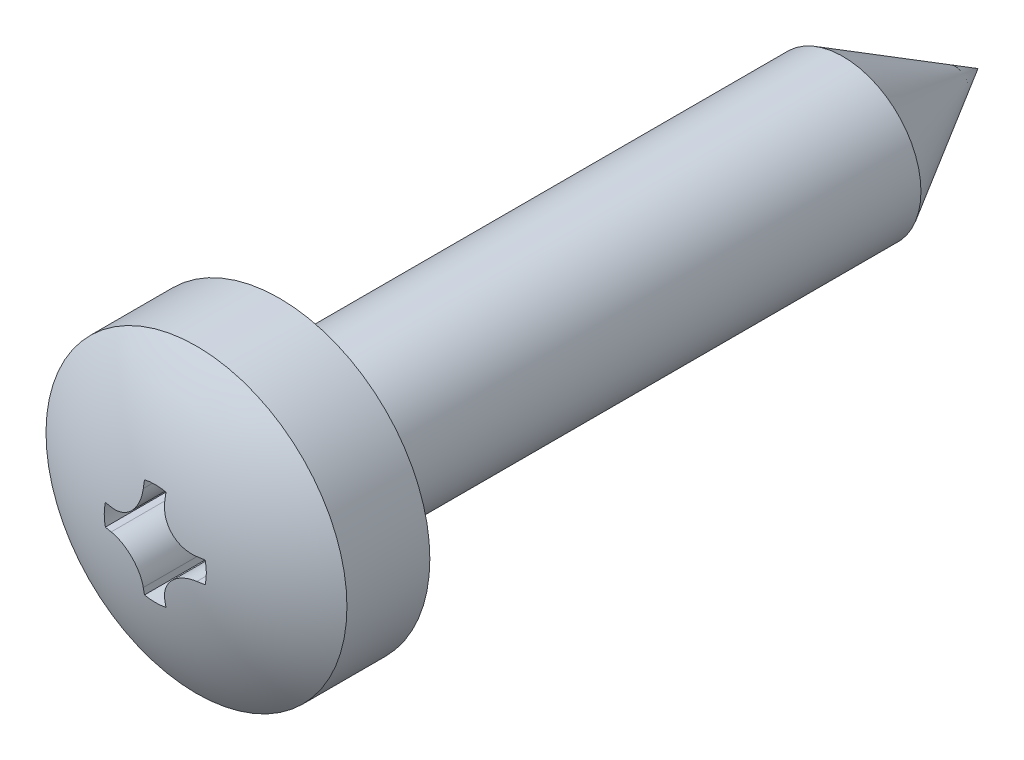
ISO-10303-21;
HEADER;
FILE_DESCRIPTION(('STEP AP214'),'2;1');
FILE_NAME('part.step','',(''),(''),'','','');
FILE_SCHEMA(('AUTOMOTIVE_DESIGN { 1 0 10303 214 1 1 1 1 }'));
ENDSEC;
DATA;
#1=APPLICATION_CONTEXT('core data for automotive mechanical design processes');
#2=APPLICATION_PROTOCOL_DEFINITION('international standard','automotive_design',2000,#1);
#3=PRODUCT_CONTEXT('',#1,'mechanical');
#4=PRODUCT('Part','Part','',(#3));
#5=PRODUCT_RELATED_PRODUCT_CATEGORY('part','',(#4));
#6=PRODUCT_DEFINITION_FORMATION('','',#4);
#7=PRODUCT_DEFINITION_CONTEXT('part definition',#1,'design');
#8=PRODUCT_DEFINITION('design','',#6,#7);
#9=PRODUCT_DEFINITION_SHAPE('','',#8);
#10=(LENGTH_UNIT() NAMED_UNIT(*) SI_UNIT(.MILLI.,.METRE.));
#11=(NAMED_UNIT(*) PLANE_ANGLE_UNIT() SI_UNIT($,.RADIAN.));
#12=(NAMED_UNIT(*) SI_UNIT($,.STERADIAN.) SOLID_ANGLE_UNIT());
#13=UNCERTAINTY_MEASURE_WITH_UNIT(LENGTH_MEASURE(1.E-05),#10,'distance_accuracy_value','');
#14=(GEOMETRIC_REPRESENTATION_CONTEXT(3) GLOBAL_UNCERTAINTY_ASSIGNED_CONTEXT((#13)) GLOBAL_UNIT_ASSIGNED_CONTEXT((#10,
#11,#12)) REPRESENTATION_CONTEXT('',''));
#15=CARTESIAN_POINT('',(0.,0.,0.));
#16=DIRECTION('',(0.,0.,1.));
#17=DIRECTION('',(1.,0.,0.));
#18=AXIS2_PLACEMENT_3D('',#15,#16,#17);
#19=CARTESIAN_POINT('',(0.,0.,10.4));
#20=DIRECTION('',(0.,0.,1.));
#21=DIRECTION('',(0.,1.,0.));
#22=AXIS2_PLACEMENT_3D('',#19,#20,#21);
#23=SPHERICAL_SURFACE('',#22,5.);
#24=CARTESIAN_POINT('',(0.,0.,14.5424630354416));
#25=DIRECTION('',(0.,0.,1.));
#26=DIRECTION('',(1.,0.,0.));
#27=AXIS2_PLACEMENT_3D('',#24,#25,#26);
#28=CIRCLE('',#27,2.8);
#29=CARTESIAN_POINT('',(2.8,0.,14.5424630354416));
#30=VERTEX_POINT('',#29);
#31=EDGE_CURVE('E187',#30,#30,#28,.T.);
#32=ORIENTED_EDGE('',*,*,#31,.T.);
#33=EDGE_LOOP('',(#32));
#34=FACE_BOUND('',#33,.T.);
#35=CARTESIAN_POINT('',(0.,0.,15.3089204515861));
#36=DIRECTION('',(0.,0.,-1.));
#37=DIRECTION('',(-1.,0.,0.));
#38=AXIS2_PLACEMENT_3D('',#35,#36,#37);
#39=CIRCLE('',#38,0.95);
#40=CARTESIAN_POINT('',(0.199999999999999,0.928708781050336,15.3089204515861));
#41=VERTEX_POINT('',#40);
#42=CARTESIAN_POINT('',(-0.199999999999997,0.928708781050336,15.3089204515861));
#43=VERTEX_POINT('',#42);
#44=EDGE_CURVE('E291',#41,#43,#39,.F.);
#45=ORIENTED_EDGE('',*,*,#44,.F.);
#46=CARTESIAN_POINT('',(0.200000000000013,0.,10.4));
#47=DIRECTION('',(-1.,0.,0.));
#48=DIRECTION('',(0.,-1.,0.));
#49=AXIS2_PLACEMENT_3D('',#46,#47,#48);
#50=CIRCLE('',#49,4.99599839871872);
#51=CARTESIAN_POINT('',(0.200000000000001,0.797500009462237,15.3319361040982));
#52=VERTEX_POINT('',#51);
#53=EDGE_CURVE('E173',#52,#41,#50,.T.);
#54=ORIENTED_EDGE('',*,*,#53,.F.);
#55=CARTESIAN_POINT('',(0.200000033472805,0.797700009462236,15.3319037583386));
#56=CARTESIAN_POINT('',(0.199959253117828,0.764708817685606,15.3372450026347));
#57=CARTESIAN_POINT('',(0.202709128813232,0.731640466129004,15.3421389681577));
#58=CARTESIAN_POINT('',(0.213653637195818,0.666282732986849,15.3509117634436));
#59=CARTESIAN_POINT('',(0.221847801353419,0.633993284617508,15.3547906805205));
#60=CARTESIAN_POINT('',(0.243555568778322,0.571088201610532,15.3614171793675));
#61=CARTESIAN_POINT('',(0.257074653927373,0.540474329048727,15.364163589265));
#62=CARTESIAN_POINT('',(0.289068737352572,0.481878485435129,15.3684353734394));
#63=CARTESIAN_POINT('',(0.307541534947129,0.453895353117194,15.3699612887238));
#64=CARTESIAN_POINT('',(0.348646595686665,0.401741777280698,15.371733860277));
#65=CARTESIAN_POINT('',(0.371219136327946,0.377524829205055,15.3719975623989));
#66=CARTESIAN_POINT('',(0.42004221247523,0.33315104363588,15.3712838517845));
#67=CARTESIAN_POINT('',(0.446293163672993,0.312994665649831,15.3703062986749));
#68=CARTESIAN_POINT('',(0.501529122246131,0.277422821121843,15.3671501235125));
#69=CARTESIAN_POINT('',(0.530496065410742,0.261978583187333,15.3649790268822));
#70=CARTESIAN_POINT('',(0.590474078177402,0.236061672214504,15.3595049326867));
#71=CARTESIAN_POINT('',(0.621484749229964,0.225588033102557,15.3562021552872));
#72=CARTESIAN_POINT('',(0.676782180778131,0.211811110107704,15.349515949383));
#73=CARTESIAN_POINT('',(0.700820773823944,0.207371844731834,15.3463573247891));
#74=CARTESIAN_POINT('',(0.749150929493059,0.201461310152338,15.3395132745871));
#75=CARTESIAN_POINT('',(0.773442081704409,0.199985810303452,15.3358286079455));
#76=CARTESIAN_POINT('',(0.797700009462238,0.200000033472804,15.3319037583386));
#77=B_SPLINE_CURVE_WITH_KNOTS('',3,(#55,#56,#57,#58,#59,#60,#61,#62,#63,#64,#65,#66,#67,#68,#69,
#70,#71,#72,#73,#74,#75,#76),.UNSPECIFIED.,.F.,.F.,(4,2,2,2,2,2,2,2,2,2,4),(0.,
0.100151318053274,0.200294018308518,0.30054008372607,0.400741688499828,0.499586204595047,
0.598441899985654,0.696681331546744,0.794901661700852,0.868668187611341,0.942329339997771),.UNSPECIFIED.);
#78=CARTESIAN_POINT('',(0.797500009462238,0.2,15.3319361040982));
#79=VERTEX_POINT('',#78);
#80=EDGE_CURVE('E282',#52,#79,#77,.T.);
#81=ORIENTED_EDGE('',*,*,#80,.T.);
#82=CARTESIAN_POINT('',(0.,0.200000000000013,10.4));
#83=DIRECTION('',(0.,1.,0.));
#84=DIRECTION('',(-1.,0.,0.));
#85=AXIS2_PLACEMENT_3D('',#82,#83,#84);
#86=CIRCLE('',#85,4.99599839871872);
#87=CARTESIAN_POINT('',(0.928708781050337,0.199999999999998,15.3089204515861));
#88=VERTEX_POINT('',#87);
#89=EDGE_CURVE('E289',#79,#88,#86,.T.);
#90=ORIENTED_EDGE('',*,*,#89,.T.);
#91=CARTESIAN_POINT('',(0.,0.,15.3089204515861));
#92=DIRECTION('',(0.,0.,-1.));
#93=DIRECTION('',(-1.,0.,0.));
#94=AXIS2_PLACEMENT_3D('',#91,#92,#93);
#95=CIRCLE('',#94,0.950000000000001);
#96=CARTESIAN_POINT('',(0.928708781050337,-0.199999999999996,15.3089204515861));
#97=VERTEX_POINT('',#96);
#98=EDGE_CURVE('E364',#88,#97,#95,.T.);
#99=ORIENTED_EDGE('',*,*,#98,.T.);
#100=CARTESIAN_POINT('',(0.,-0.200000000000022,10.4));
#101=DIRECTION('',(0.,1.,0.));
#102=DIRECTION('',(-1.,0.,0.));
#103=AXIS2_PLACEMENT_3D('',#100,#101,#102);
#104=CIRCLE('',#103,4.99599839871872);
#105=CARTESIAN_POINT('',(0.797500009462238,-0.2,15.3319361040982));
#106=VERTEX_POINT('',#105);
#107=EDGE_CURVE('E254',#106,#97,#104,.T.);
#108=ORIENTED_EDGE('',*,*,#107,.F.);
#109=CARTESIAN_POINT('',(0.200000033472805,-0.797700009462236,15.3319037583386));
#110=CARTESIAN_POINT('',(0.199959253117828,-0.764708817685605,15.3372450026347));
#111=CARTESIAN_POINT('',(0.202709128813232,-0.731640466129003,15.3421389681577));
#112=CARTESIAN_POINT('',(0.213653637195818,-0.666282732986848,15.3509117634436));
#113=CARTESIAN_POINT('',(0.221847801353419,-0.633993284617508,15.3547906805205));
#114=CARTESIAN_POINT('',(0.243555568778322,-0.571088201610531,15.3614171793675));
#115=CARTESIAN_POINT('',(0.257074653927373,-0.540474329048727,15.364163589265));
#116=CARTESIAN_POINT('',(0.289068737352572,-0.481878485435129,15.3684353734394));
#117=CARTESIAN_POINT('',(0.30754153494713,-0.453895353117194,15.3699612887238));
#118=CARTESIAN_POINT('',(0.348646595686666,-0.401741777280697,15.371733860277));
#119=CARTESIAN_POINT('',(0.371219136327946,-0.377524829205055,15.3719975623989));
#120=CARTESIAN_POINT('',(0.42004221247523,-0.33315104363588,15.3712838517845));
#121=CARTESIAN_POINT('',(0.446293163672993,-0.31299466564983,15.370306298675));
#122=CARTESIAN_POINT('',(0.501529122246131,-0.277422821121843,15.3671501235125));
#123=CARTESIAN_POINT('',(0.530496065410743,-0.261978583187333,15.3649790268822));
#124=CARTESIAN_POINT('',(0.590474078177402,-0.236061672214504,15.3595049326867));
#125=CARTESIAN_POINT('',(0.621484749229964,-0.225588033102557,15.3562021552872));
#126=CARTESIAN_POINT('',(0.676782180778131,-0.211811110107704,15.349515949383));
#127=CARTESIAN_POINT('',(0.700820773823944,-0.207371844731834,15.3463573247891));
#128=CARTESIAN_POINT('',(0.749150929493059,-0.201461310152338,15.3395132745871));
#129=CARTESIAN_POINT('',(0.773442081704409,-0.199985810303452,15.3358286079455));
#130=CARTESIAN_POINT('',(0.797700009462237,-0.200000033472804,15.3319037583386));
#131=B_SPLINE_CURVE_WITH_KNOTS('',3,(#109,#110,#111,#112,#113,#114,#115,#116,#117,#118,#119,
#120,#121,#122,#123,#124,#125,#126,#127,#128,#129,#130),.UNSPECIFIED.,.F.,.F.,(4,2,2,2,2,2,2,2,
2,2,4),(0.,0.100151318053274,0.200294018308518,0.300540083726071,0.400741688499828,
0.499586204595048,0.598441899985654,0.696681331546745,0.794901661700852,0.868668187611341,
0.94232933999777),.UNSPECIFIED.);
#132=CARTESIAN_POINT('',(0.200000000000001,-0.797500009462237,15.3319361040982));
#133=VERTEX_POINT('',#132);
#134=EDGE_CURVE('E248',#133,#106,#131,.T.);
#135=ORIENTED_EDGE('',*,*,#134,.F.);
#136=CARTESIAN_POINT('',(0.20000000000001,0.,10.4));
#137=DIRECTION('',(1.,0.,0.));
#138=DIRECTION('',(0.,1.,0.));
#139=AXIS2_PLACEMENT_3D('',#136,#137,#138);
#140=CIRCLE('',#139,4.99599839871872);
#141=CARTESIAN_POINT('',(0.199999999999999,-0.928708781050336,15.3089204515861));
#142=VERTEX_POINT('',#141);
#143=EDGE_CURVE('E245',#133,#142,#140,.T.);
#144=ORIENTED_EDGE('',*,*,#143,.T.);
#145=CARTESIAN_POINT('',(0.,0.,15.3089204515861));
#146=DIRECTION('',(0.,0.,-1.));
#147=DIRECTION('',(-1.,0.,0.));
#148=AXIS2_PLACEMENT_3D('',#145,#146,#147);
#149=CIRCLE('',#148,0.95);
#150=CARTESIAN_POINT('',(-0.199999999999997,-0.928708781050336,15.3089204515861));
#151=VERTEX_POINT('',#150);
#152=EDGE_CURVE('E242',#142,#151,#149,.T.);
#153=ORIENTED_EDGE('',*,*,#152,.T.);
#154=CARTESIAN_POINT('',(-0.200000000000015,0.,10.4));
#155=DIRECTION('',(1.,0.,0.));
#156=DIRECTION('',(0.,1.,0.));
#157=AXIS2_PLACEMENT_3D('',#154,#155,#156);
#158=CIRCLE('',#157,4.99599839871872);
#159=CARTESIAN_POINT('',(-0.2,-0.797500009462236,15.3319361040982));
#160=VERTEX_POINT('',#159);
#161=EDGE_CURVE('E239',#160,#151,#158,.T.);
#162=ORIENTED_EDGE('',*,*,#161,.F.);
#163=CARTESIAN_POINT('',(-0.200000033472803,-0.797700009462235,15.3319037583386));
#164=CARTESIAN_POINT('',(-0.199959253117827,-0.764708817685605,15.3372450026347));
#165=CARTESIAN_POINT('',(-0.202709128813231,-0.731640466129003,15.3421389681577));
#166=CARTESIAN_POINT('',(-0.213653637195817,-0.666282732986847,15.3509117634436));
#167=CARTESIAN_POINT('',(-0.221847801353417,-0.633993284617507,15.3547906805205));
#168=CARTESIAN_POINT('',(-0.243555568778321,-0.57108820161053,15.3614171793675));
#169=CARTESIAN_POINT('',(-0.257074653927372,-0.540474329048725,15.364163589265));
#170=CARTESIAN_POINT('',(-0.289068737352571,-0.481878485435128,15.3684353734394));
#171=CARTESIAN_POINT('',(-0.307541534947129,-0.453895353117193,15.3699612887238));
#172=CARTESIAN_POINT('',(-0.348646595686664,-0.401741777280696,15.371733860277));
#173=CARTESIAN_POINT('',(-0.371219136327945,-0.377524829205054,15.3719975623989));
#174=CARTESIAN_POINT('',(-0.420042212475229,-0.333151043635879,15.3712838517845));
#175=CARTESIAN_POINT('',(-0.446293163672992,-0.312994665649829,15.370306298675));
#176=CARTESIAN_POINT('',(-0.50152912224613,-0.277422821121842,15.3671501235125));
#177=CARTESIAN_POINT('',(-0.530496065410741,-0.261978583187332,15.3649790268822));
#178=CARTESIAN_POINT('',(-0.590474078177401,-0.236061672214503,15.3595049326867));
#179=CARTESIAN_POINT('',(-0.621484749229963,-0.225588033102557,15.3562021552872));
#180=CARTESIAN_POINT('',(-0.676782180778129,-0.211811110107703,15.349515949383));
#181=CARTESIAN_POINT('',(-0.700820773823943,-0.207371844731833,15.3463573247891));
#182=CARTESIAN_POINT('',(-0.749150929493057,-0.201461310152337,15.3395132745871));
#183=CARTESIAN_POINT('',(-0.773442081704407,-0.199985810303451,15.3358286079455));
#184=CARTESIAN_POINT('',(-0.797700009462235,-0.200000033472803,15.3319037583386));
#185=B_SPLINE_CURVE_WITH_KNOTS('',3,(#163,#164,#165,#166,#167,#168,#169,#170,#171,#172,#173,
#174,#175,#176,#177,#178,#179,#180,#181,#182,#183,#184),.UNSPECIFIED.,.F.,.F.,(4,2,2,2,2,2,2,2,
2,2,4),(0.,0.100151318053273,0.200294018308518,0.300540083726071,0.400741688499828,
0.499586204595048,0.598441899985654,0.696681331546744,0.794901661700852,0.868668187611341,
0.942329339997769),.UNSPECIFIED.);
#186=CARTESIAN_POINT('',(-0.797500009462236,-0.199999999999999,15.3319361040982));
#187=VERTEX_POINT('',#186);
#188=EDGE_CURVE('E232',#160,#187,#185,.T.);
#189=ORIENTED_EDGE('',*,*,#188,.T.);
#190=CARTESIAN_POINT('',(0.,-0.200000000000015,10.4));
#191=DIRECTION('',(0.,-1.,0.));
#192=DIRECTION('',(1.,0.,0.));
#193=AXIS2_PLACEMENT_3D('',#190,#191,#192);
#194=CIRCLE('',#193,4.99599839871872);
#195=CARTESIAN_POINT('',(-0.928708781050336,-0.199999999999997,15.3089204515861));
#196=VERTEX_POINT('',#195);
#197=EDGE_CURVE('E240',#187,#196,#194,.T.);
#198=ORIENTED_EDGE('',*,*,#197,.T.);
#199=CARTESIAN_POINT('',(0.,0.,15.3089204515861));
#200=DIRECTION('',(0.,0.,-1.));
#201=DIRECTION('',(-1.,0.,0.));
#202=AXIS2_PLACEMENT_3D('',#199,#200,#201);
#203=CIRCLE('',#202,0.95);
#204=CARTESIAN_POINT('',(-0.928708781050336,0.199999999999997,15.3089204515861));
#205=VERTEX_POINT('',#204);
#206=EDGE_CURVE('E403',#205,#196,#203,.F.);
#207=ORIENTED_EDGE('',*,*,#206,.F.);
#208=CARTESIAN_POINT('',(0.,0.200000000000015,10.4));
#209=DIRECTION('',(0.,-1.,0.));
#210=DIRECTION('',(1.,0.,0.));
#211=AXIS2_PLACEMENT_3D('',#208,#209,#210);
#212=CIRCLE('',#211,4.99599839871872);
#213=CARTESIAN_POINT('',(-0.797500009462236,0.199999999999999,15.3319361040982));
#214=VERTEX_POINT('',#213);
#215=EDGE_CURVE('E200',#214,#205,#212,.T.);
#216=ORIENTED_EDGE('',*,*,#215,.F.);
#217=CARTESIAN_POINT('',(-0.200000033472804,0.797700009462235,15.3319037583386));
#218=CARTESIAN_POINT('',(-0.199959253117827,0.764708817685605,15.3372450026347));
#219=CARTESIAN_POINT('',(-0.202709128813231,0.731640466129002,15.3421389681577));
#220=CARTESIAN_POINT('',(-0.213653637195817,0.666282732986847,15.3509117634436));
#221=CARTESIAN_POINT('',(-0.221847801353417,0.633993284617507,15.3547906805205));
#222=CARTESIAN_POINT('',(-0.24355556877832,0.571088201610531,15.3614171793675));
#223=CARTESIAN_POINT('',(-0.257074653927372,0.540474329048726,15.364163589265));
#224=CARTESIAN_POINT('',(-0.28906873735257,0.481878485435128,15.3684353734394));
#225=CARTESIAN_POINT('',(-0.307541534947128,0.453895353117193,15.3699612887238));
#226=CARTESIAN_POINT('',(-0.348646595686664,0.401741777280697,15.371733860277));
#227=CARTESIAN_POINT('',(-0.371219136327945,0.377524829205054,15.3719975623989));
#228=CARTESIAN_POINT('',(-0.420042212475228,0.333151043635879,15.3712838517845));
#229=CARTESIAN_POINT('',(-0.446293163672991,0.31299466564983,15.370306298675));
#230=CARTESIAN_POINT('',(-0.501529122246129,0.277422821121843,15.3671501235125));
#231=CARTESIAN_POINT('',(-0.53049606541074,0.261978583187332,15.3649790268822));
#232=CARTESIAN_POINT('',(-0.5904740781774,0.236061672214503,15.3595049326867));
#233=CARTESIAN_POINT('',(-0.621484749229962,0.225588033102557,15.3562021552872));
#234=CARTESIAN_POINT('',(-0.676782180778129,0.211811110107703,15.349515949383));
#235=CARTESIAN_POINT('',(-0.700820773823943,0.207371844731833,15.3463573247891));
#236=CARTESIAN_POINT('',(-0.749150929493057,0.201461310152337,15.3395132745871));
#237=CARTESIAN_POINT('',(-0.773442081704407,0.199985810303451,15.3358286079455));
#238=CARTESIAN_POINT('',(-0.797700009462235,0.200000033472803,15.3319037583386));
#239=B_SPLINE_CURVE_WITH_KNOTS('',3,(#217,#218,#219,#220,#221,#222,#223,#224,#225,#226,#227,
#228,#229,#230,#231,#232,#233,#234,#235,#236,#237,#238),.UNSPECIFIED.,.F.,.F.,(4,2,2,2,2,2,2,2,
2,2,4),(0.,0.100151318053274,0.200294018308518,0.30054008372607,0.400741688499828,
0.499586204595047,0.598441899985653,0.696681331546744,0.794901661700851,0.868668187611341,
0.94232933999777),.UNSPECIFIED.);
#240=CARTESIAN_POINT('',(-0.2,0.797500009462236,15.3319361040982));
#241=VERTEX_POINT('',#240);
#242=EDGE_CURVE('E193',#241,#214,#239,.T.);
#243=ORIENTED_EDGE('',*,*,#242,.F.);
#244=CARTESIAN_POINT('',(-0.200000000000015,0.,10.4));
#245=DIRECTION('',(-1.,0.,0.));
#246=DIRECTION('',(0.,-1.,0.));
#247=AXIS2_PLACEMENT_3D('',#244,#245,#246);
#248=CIRCLE('',#247,4.99599839871872);
#249=EDGE_CURVE('E190',#241,#43,#248,.T.);
#250=ORIENTED_EDGE('',*,*,#249,.T.);
#251=EDGE_LOOP('',(#45,#54,#81,#90,#99,#108,#135,#144,#153,#162,#189,#198,#207,#216,#243,#250));
#252=FACE_BOUND('',#251,.T.);
#253=ADVANCED_FACE('F38',(#34,#252),#23,.T.);
#254=CARTESIAN_POINT('',(0.,0.,0.));
#255=DIRECTION('',(0.,0.,1.));
#256=DIRECTION('',(1.,0.,0.));
#257=AXIS2_PLACEMENT_3D('',#254,#255,#256);
#258=CONICAL_SURFACE('',#257,0.,0.523598775598293);
#259=CARTESIAN_POINT('',(0.,0.,2.5114736709749));
#260=DIRECTION('',(0.,0.,1.));
#261=DIRECTION('',(1.,0.,0.));
#262=AXIS2_PLACEMENT_3D('',#259,#260,#261);
#263=CIRCLE('',#262,1.45);
#264=CARTESIAN_POINT('',(1.45,0.,2.5114736709749));
#265=VERTEX_POINT('',#264);
#266=EDGE_CURVE('E174',#265,#265,#263,.T.);
#267=ORIENTED_EDGE('',*,*,#266,.F.);
#268=EDGE_LOOP('',(#267));
#269=FACE_BOUND('',#268,.T.);
#270=CARTESIAN_POINT('',(0.,0.,0.));
#271=VERTEX_POINT('',#270);
#272=VERTEX_LOOP('',#271);
#273=FACE_BOUND('',#272,.T.);
#274=ADVANCED_FACE('F305',(#269,#273),#258,.T.);
#275=CARTESIAN_POINT('',(0.,0.,11.71));
#276=DIRECTION('',(0.,0.,1.));
#277=DIRECTION('',(1.,0.,0.));
#278=AXIS2_PLACEMENT_3D('',#275,#276,#277);
#279=CYLINDRICAL_SURFACE('',#278,2.8);
#280=ORIENTED_EDGE('',*,*,#31,.F.);
#281=EDGE_LOOP('',(#280));
#282=FACE_BOUND('',#281,.T.);
#283=CARTESIAN_POINT('',(0.,0.,13.));
#284=DIRECTION('',(0.,0.,1.));
#285=DIRECTION('',(1.,0.,0.));
#286=AXIS2_PLACEMENT_3D('',#283,#284,#285);
#287=CIRCLE('',#286,2.8);
#288=CARTESIAN_POINT('',(2.8,0.,13.));
#289=VERTEX_POINT('',#288);
#290=EDGE_CURVE('E178',#289,#289,#287,.T.);
#291=ORIENTED_EDGE('',*,*,#290,.T.);
#292=EDGE_LOOP('',(#291));
#293=FACE_BOUND('',#292,.T.);
#294=ADVANCED_FACE('F310',(#282,#293),#279,.T.);
#295=CARTESIAN_POINT('',(0.,2.8,13.));
#296=DIRECTION('',(0.,0.,1.));
#297=DIRECTION('',(1.,0.,0.));
#298=AXIS2_PLACEMENT_3D('',#295,#296,#297);
#299=PLANE('',#298);
#300=CARTESIAN_POINT('',(0.,0.,13.));
#301=DIRECTION('',(0.,0.,1.));
#302=DIRECTION('',(1.,0.,0.));
#303=AXIS2_PLACEMENT_3D('',#300,#301,#302);
#304=CIRCLE('',#303,1.55);
#305=CARTESIAN_POINT('',(1.55,0.,13.));
#306=VERTEX_POINT('',#305);
#307=EDGE_CURVE('E47',#306,#306,#304,.T.);
#308=ORIENTED_EDGE('',*,*,#307,.T.);
#309=EDGE_LOOP('',(#308));
#310=FACE_BOUND('',#309,.T.);
#311=ORIENTED_EDGE('',*,*,#290,.F.);
#312=EDGE_LOOP('',(#311));
#313=FACE_BOUND('',#312,.T.);
#314=ADVANCED_FACE('F295',(#310,#313),#299,.F.);
#315=CARTESIAN_POINT('',(0.,0.,11.71));
#316=DIRECTION('',(0.,0.,1.));
#317=DIRECTION('',(1.,0.,0.));
#318=AXIS2_PLACEMENT_3D('',#315,#316,#317);
#319=CYLINDRICAL_SURFACE('',#318,1.45);
#320=CARTESIAN_POINT('',(0.,0.,12.9));
#321=DIRECTION('',(0.,0.,1.));
#322=DIRECTION('',(1.,0.,0.));
#323=AXIS2_PLACEMENT_3D('',#320,#321,#322);
#324=CIRCLE('',#323,1.45);
#325=CARTESIAN_POINT('',(1.45,0.,12.9));
#326=VERTEX_POINT('',#325);
#327=EDGE_CURVE('E11',#326,#326,#324,.F.);
#328=ORIENTED_EDGE('',*,*,#327,.T.);
#329=EDGE_LOOP('',(#328));
#330=FACE_BOUND('',#329,.T.);
#331=ORIENTED_EDGE('',*,*,#266,.T.);
#332=EDGE_LOOP('',(#331));
#333=FACE_BOUND('',#332,.T.);
#334=ADVANCED_FACE('F457',(#330,#333),#319,.T.);
#335=CARTESIAN_POINT('',(0.,0.,14.2));
#336=DIRECTION('',(0.,0.,1.));
#337=DIRECTION('',(1.,0.,0.));
#338=AXIS2_PLACEMENT_3D('',#335,#336,#337);
#339=CYLINDRICAL_SURFACE('',#338,0.95);
#340=ORIENTED_EDGE('',*,*,#44,.T.);
#341=DIRECTION('',(0.,0.,1.));
#342=VECTOR('',#341,1.);
#343=CARTESIAN_POINT('',(-0.199999999999997,0.928708781050336,14.2));
#344=LINE('',#343,#342);
#345=CARTESIAN_POINT('',(-0.199999999999997,0.928708781050336,14.2));
#346=VERTEX_POINT('',#345);
#347=EDGE_CURVE('E54',#346,#43,#344,.T.);
#348=ORIENTED_EDGE('',*,*,#347,.F.);
#349=CARTESIAN_POINT('',(0.,0.,14.2));
#350=DIRECTION('',(0.,0.,-1.));
#351=DIRECTION('',(-1.,0.,0.));
#352=AXIS2_PLACEMENT_3D('',#349,#350,#351);
#353=CIRCLE('',#352,0.95);
#354=CARTESIAN_POINT('',(0.199999999999999,0.928708781050336,14.2));
#355=VERTEX_POINT('',#354);
#356=EDGE_CURVE('E156',#346,#355,#353,.T.);
#357=ORIENTED_EDGE('',*,*,#356,.T.);
#358=DIRECTION('',(0.,0.,1.));
#359=VECTOR('',#358,1.);
#360=CARTESIAN_POINT('',(0.199999999999999,0.928708781050336,14.2));
#361=LINE('',#360,#359);
#362=EDGE_CURVE('E168',#355,#41,#361,.T.);
#363=ORIENTED_EDGE('',*,*,#362,.T.);
#364=EDGE_LOOP('',(#340,#348,#357,#363));
#365=FACE_BOUND('',#364,.T.);
#366=ADVANCED_FACE('F167',(#365),#339,.F.);
#367=CARTESIAN_POINT('',(0.199999999999999,0.928708781050336,14.2));
#368=DIRECTION('',(-1.,0.,0.));
#369=DIRECTION('',(0.,-1.,0.));
#370=AXIS2_PLACEMENT_3D('',#367,#368,#369);
#371=PLANE('',#370);
#372=ORIENTED_EDGE('',*,*,#53,.T.);
#373=ORIENTED_EDGE('',*,*,#362,.F.);
#374=DIRECTION('',(0.,-1.,0.));
#375=VECTOR('',#374,1.);
#376=CARTESIAN_POINT('',(0.199999999999999,0.928708781050336,14.2));
#377=LINE('',#376,#375);
#378=CARTESIAN_POINT('',(0.200000000000001,0.797500009462237,14.2));
#379=VERTEX_POINT('',#378);
#380=EDGE_CURVE('E152',#355,#379,#377,.T.);
#381=ORIENTED_EDGE('',*,*,#380,.T.);
#382=DIRECTION('',(0.,0.,1.));
#383=VECTOR('',#382,1.);
#384=CARTESIAN_POINT('',(0.200000000000001,0.797500009462237,14.2));
#385=LINE('',#384,#383);
#386=EDGE_CURVE('E175',#379,#52,#385,.T.);
#387=ORIENTED_EDGE('',*,*,#386,.T.);
#388=EDGE_LOOP('',(#372,#373,#381,#387));
#389=FACE_BOUND('',#388,.T.);
#390=ADVANCED_FACE('F171',(#389),#371,.T.);
#391=CARTESIAN_POINT('',(0.797500009462238,0.797500009462237,14.2));
#392=DIRECTION('',(0.,0.,1.));
#393=DIRECTION('',(1.,0.,0.));
#394=AXIS2_PLACEMENT_3D('',#391,#392,#393);
#395=CYLINDRICAL_SURFACE('',#394,0.597500009462237);
#396=ORIENTED_EDGE('',*,*,#386,.F.);
#397=CARTESIAN_POINT('',(0.797500009462238,0.797500009462237,14.2));
#398=DIRECTION('',(0.,0.,-1.));
#399=DIRECTION('',(-1.,0.,0.));
#400=AXIS2_PLACEMENT_3D('',#397,#398,#399);
#401=CIRCLE('',#400,0.597500009462237);
#402=CARTESIAN_POINT('',(0.797500009462238,0.2,14.2));
#403=VERTEX_POINT('',#402);
#404=EDGE_CURVE('E159',#403,#379,#401,.T.);
#405=ORIENTED_EDGE('',*,*,#404,.F.);
#406=DIRECTION('',(0.,0.,1.));
#407=VECTOR('',#406,1.);
#408=CARTESIAN_POINT('',(0.797500009462238,0.2,14.2));
#409=LINE('',#408,#407);
#410=EDGE_CURVE('E180',#403,#79,#409,.T.);
#411=ORIENTED_EDGE('',*,*,#410,.T.);
#412=ORIENTED_EDGE('',*,*,#80,.F.);
#413=EDGE_LOOP('',(#396,#405,#411,#412));
#414=FACE_BOUND('',#413,.T.);
#415=ADVANCED_FACE('F274',(#414),#395,.T.);
#416=CARTESIAN_POINT('',(0.928708781050337,0.199999999999998,14.2));
#417=DIRECTION('',(0.,1.,0.));
#418=DIRECTION('',(-1.,0.,0.));
#419=AXIS2_PLACEMENT_3D('',#416,#417,#418);
#420=PLANE('',#419);
#421=ORIENTED_EDGE('',*,*,#410,.F.);
#422=DIRECTION('',(-1.,0.,0.));
#423=VECTOR('',#422,1.);
#424=CARTESIAN_POINT('',(0.928708781050337,0.199999999999998,14.2));
#425=LINE('',#424,#423);
#426=CARTESIAN_POINT('',(0.928708781050337,0.199999999999998,14.2));
#427=VERTEX_POINT('',#426);
#428=EDGE_CURVE('E372',#427,#403,#425,.T.);
#429=ORIENTED_EDGE('',*,*,#428,.F.);
#430=DIRECTION('',(0.,0.,1.));
#431=VECTOR('',#430,1.);
#432=CARTESIAN_POINT('',(0.928708781050337,0.199999999999998,14.2));
#433=LINE('',#432,#431);
#434=EDGE_CURVE('E357',#427,#88,#433,.T.);
#435=ORIENTED_EDGE('',*,*,#434,.T.);
#436=ORIENTED_EDGE('',*,*,#89,.F.);
#437=EDGE_LOOP('',(#421,#429,#435,#436));
#438=FACE_BOUND('',#437,.T.);
#439=ADVANCED_FACE('F270',(#438),#420,.F.);
#440=CARTESIAN_POINT('',(0.,0.,14.2));
#441=DIRECTION('',(0.,0.,1.));
#442=DIRECTION('',(1.,0.,0.));
#443=AXIS2_PLACEMENT_3D('',#440,#441,#442);
#444=CYLINDRICAL_SURFACE('',#443,0.950000000000001);
#445=ORIENTED_EDGE('',*,*,#434,.F.);
#446=CARTESIAN_POINT('',(0.,0.,14.2));
#447=DIRECTION('',(0.,0.,1.));
#448=DIRECTION('',(1.,0.,0.));
#449=AXIS2_PLACEMENT_3D('',#446,#447,#448);
#450=CIRCLE('',#449,0.950000000000001);
#451=CARTESIAN_POINT('',(0.928708781050337,-0.199999999999997,14.2));
#452=VERTEX_POINT('',#451);
#453=EDGE_CURVE('E370',#452,#427,#450,.T.);
#454=ORIENTED_EDGE('',*,*,#453,.F.);
#455=DIRECTION('',(0.,0.,1.));
#456=VECTOR('',#455,1.);
#457=CARTESIAN_POINT('',(0.928708781050337,-0.199999999999997,14.2));
#458=LINE('',#457,#456);
#459=EDGE_CURVE('E354',#452,#97,#458,.T.);
#460=ORIENTED_EDGE('',*,*,#459,.T.);
#461=ORIENTED_EDGE('',*,*,#98,.F.);
#462=EDGE_LOOP('',(#445,#454,#460,#461));
#463=FACE_BOUND('',#462,.T.);
#464=ADVANCED_FACE('F266',(#463),#444,.F.);
#465=CARTESIAN_POINT('',(0.928708781050338,-0.199999999999996,14.2));
#466=DIRECTION('',(0.,1.,0.));
#467=DIRECTION('',(-1.,0.,0.));
#468=AXIS2_PLACEMENT_3D('',#465,#466,#467);
#469=PLANE('',#468);
#470=ORIENTED_EDGE('',*,*,#107,.T.);
#471=ORIENTED_EDGE('',*,*,#459,.F.);
#472=DIRECTION('',(-1.,0.,0.));
#473=VECTOR('',#472,1.);
#474=CARTESIAN_POINT('',(0.928708781050338,-0.199999999999996,14.2));
#475=LINE('',#474,#473);
#476=CARTESIAN_POINT('',(0.797500009462238,-0.2,14.2));
#477=VERTEX_POINT('',#476);
#478=EDGE_CURVE('E371',#452,#477,#475,.T.);
#479=ORIENTED_EDGE('',*,*,#478,.T.);
#480=DIRECTION('',(0.,0.,1.));
#481=VECTOR('',#480,1.);
#482=CARTESIAN_POINT('',(0.797500009462238,-0.2,14.2));
#483=LINE('',#482,#481);
#484=EDGE_CURVE('E351',#477,#106,#483,.T.);
#485=ORIENTED_EDGE('',*,*,#484,.T.);
#486=EDGE_LOOP('',(#470,#471,#479,#485));
#487=FACE_BOUND('',#486,.T.);
#488=ADVANCED_FACE('F262',(#487),#469,.T.);
#489=CARTESIAN_POINT('',(0.797500009462238,-0.797500009462237,14.2));
#490=DIRECTION('',(0.,0.,1.));
#491=DIRECTION('',(1.,0.,0.));
#492=AXIS2_PLACEMENT_3D('',#489,#490,#491);
#493=CYLINDRICAL_SURFACE('',#492,0.597500009462237);
#494=ORIENTED_EDGE('',*,*,#134,.T.);
#495=ORIENTED_EDGE('',*,*,#484,.F.);
#496=CARTESIAN_POINT('',(0.797500009462238,-0.797500009462237,14.2));
#497=DIRECTION('',(0.,0.,1.));
#498=DIRECTION('',(1.,0.,0.));
#499=AXIS2_PLACEMENT_3D('',#496,#497,#498);
#500=CIRCLE('',#499,0.597500009462237);
#501=CARTESIAN_POINT('',(0.200000000000001,-0.797500009462237,14.2));
#502=VERTEX_POINT('',#501);
#503=EDGE_CURVE('E374',#477,#502,#500,.T.);
#504=ORIENTED_EDGE('',*,*,#503,.T.);
#505=DIRECTION('',(0.,0.,1.));
#506=VECTOR('',#505,1.);
#507=CARTESIAN_POINT('',(0.200000000000001,-0.797500009462237,14.2));
#508=LINE('',#507,#506);
#509=EDGE_CURVE('E348',#502,#133,#508,.T.);
#510=ORIENTED_EDGE('',*,*,#509,.T.);
#511=EDGE_LOOP('',(#494,#495,#504,#510));
#512=FACE_BOUND('',#511,.T.);
#513=ADVANCED_FACE('F256',(#512),#493,.T.);
#514=CARTESIAN_POINT('',(0.199999999999999,-0.928708781050336,14.2));
#515=DIRECTION('',(1.,0.,0.));
#516=DIRECTION('',(0.,1.,0.));
#517=AXIS2_PLACEMENT_3D('',#514,#515,#516);
#518=PLANE('',#517);
#519=ORIENTED_EDGE('',*,*,#509,.F.);
#520=DIRECTION('',(0.,1.,0.));
#521=VECTOR('',#520,1.);
#522=CARTESIAN_POINT('',(0.199999999999999,-0.928708781050336,14.2));
#523=LINE('',#522,#521);
#524=CARTESIAN_POINT('',(0.199999999999999,-0.928708781050336,14.2));
#525=VERTEX_POINT('',#524);
#526=EDGE_CURVE('E380',#525,#502,#523,.T.);
#527=ORIENTED_EDGE('',*,*,#526,.F.);
#528=DIRECTION('',(0.,0.,1.));
#529=VECTOR('',#528,1.);
#530=CARTESIAN_POINT('',(0.199999999999999,-0.928708781050336,14.2));
#531=LINE('',#530,#529);
#532=EDGE_CURVE('E345',#525,#142,#531,.T.);
#533=ORIENTED_EDGE('',*,*,#532,.T.);
#534=ORIENTED_EDGE('',*,*,#143,.F.);
#535=EDGE_LOOP('',(#519,#527,#533,#534));
#536=FACE_BOUND('',#535,.T.);
#537=ADVANCED_FACE('F261',(#536),#518,.F.);
#538=CARTESIAN_POINT('',(0.,0.,14.2));
#539=DIRECTION('',(0.,0.,1.));
#540=DIRECTION('',(1.,0.,0.));
#541=AXIS2_PLACEMENT_3D('',#538,#539,#540);
#542=CYLINDRICAL_SURFACE('',#541,0.95);
#543=ORIENTED_EDGE('',*,*,#532,.F.);
#544=CARTESIAN_POINT('',(0.,0.,14.2));
#545=DIRECTION('',(0.,0.,1.));
#546=DIRECTION('',(1.,0.,0.));
#547=AXIS2_PLACEMENT_3D('',#544,#545,#546);
#548=CIRCLE('',#547,0.95);
#549=CARTESIAN_POINT('',(-0.199999999999997,-0.928708781050336,14.2));
#550=VERTEX_POINT('',#549);
#551=EDGE_CURVE('E383',#550,#525,#548,.T.);
#552=ORIENTED_EDGE('',*,*,#551,.F.);
#553=DIRECTION('',(0.,0.,1.));
#554=VECTOR('',#553,1.);
#555=CARTESIAN_POINT('',(-0.199999999999997,-0.928708781050336,14.2));
#556=LINE('',#555,#554);
#557=EDGE_CURVE('E342',#550,#151,#556,.T.);
#558=ORIENTED_EDGE('',*,*,#557,.T.);
#559=ORIENTED_EDGE('',*,*,#152,.F.);
#560=EDGE_LOOP('',(#543,#552,#558,#559));
#561=FACE_BOUND('',#560,.T.);
#562=ADVANCED_FACE('F412',(#561),#542,.F.);
#563=CARTESIAN_POINT('',(-0.199999999999997,-0.928708781050336,14.2));
#564=DIRECTION('',(1.,0.,0.));
#565=DIRECTION('',(0.,1.,0.));
#566=AXIS2_PLACEMENT_3D('',#563,#564,#565);
#567=PLANE('',#566);
#568=ORIENTED_EDGE('',*,*,#161,.T.);
#569=ORIENTED_EDGE('',*,*,#557,.F.);
#570=DIRECTION('',(0.,1.,0.));
#571=VECTOR('',#570,1.);
#572=CARTESIAN_POINT('',(-0.199999999999997,-0.928708781050336,14.2));
#573=LINE('',#572,#571);
#574=CARTESIAN_POINT('',(-0.2,-0.797500009462236,14.2));
#575=VERTEX_POINT('',#574);
#576=EDGE_CURVE('E386',#550,#575,#573,.T.);
#577=ORIENTED_EDGE('',*,*,#576,.T.);
#578=DIRECTION('',(0.,0.,1.));
#579=VECTOR('',#578,1.);
#580=CARTESIAN_POINT('',(-0.2,-0.797500009462236,14.2));
#581=LINE('',#580,#579);
#582=EDGE_CURVE('E339',#575,#160,#581,.T.);
#583=ORIENTED_EDGE('',*,*,#582,.T.);
#584=EDGE_LOOP('',(#568,#569,#577,#583));
#585=FACE_BOUND('',#584,.T.);
#586=ADVANCED_FACE('F228',(#585),#567,.T.);
#587=CARTESIAN_POINT('',(-0.797500009462237,-0.797500009462236,14.2));
#588=DIRECTION('',(0.,0.,1.));
#589=DIRECTION('',(1.,0.,0.));
#590=AXIS2_PLACEMENT_3D('',#587,#588,#589);
#591=CYLINDRICAL_SURFACE('',#590,0.597500009462237);
#592=ORIENTED_EDGE('',*,*,#582,.F.);
#593=CARTESIAN_POINT('',(-0.797500009462237,-0.797500009462236,14.2));
#594=DIRECTION('',(0.,0.,-1.));
#595=DIRECTION('',(-1.,0.,0.));
#596=AXIS2_PLACEMENT_3D('',#593,#594,#595);
#597=CIRCLE('',#596,0.597500009462237);
#598=CARTESIAN_POINT('',(-0.797500009462236,-0.199999999999999,14.2));
#599=VERTEX_POINT('',#598);
#600=EDGE_CURVE('E388',#599,#575,#597,.T.);
#601=ORIENTED_EDGE('',*,*,#600,.F.);
#602=DIRECTION('',(0.,0.,1.));
#603=VECTOR('',#602,1.);
#604=CARTESIAN_POINT('',(-0.797500009462236,-0.199999999999999,14.2));
#605=LINE('',#604,#603);
#606=EDGE_CURVE('E336',#599,#187,#605,.T.);
#607=ORIENTED_EDGE('',*,*,#606,.T.);
#608=ORIENTED_EDGE('',*,*,#188,.F.);
#609=EDGE_LOOP('',(#592,#601,#607,#608));
#610=FACE_BOUND('',#609,.T.);
#611=ADVANCED_FACE('F223',(#610),#591,.T.);
#612=CARTESIAN_POINT('',(-0.928708781050336,-0.199999999999997,14.2));
#613=DIRECTION('',(0.,-1.,0.));
#614=DIRECTION('',(1.,0.,0.));
#615=AXIS2_PLACEMENT_3D('',#612,#613,#614);
#616=PLANE('',#615);
#617=ORIENTED_EDGE('',*,*,#606,.F.);
#618=DIRECTION('',(1.,0.,0.));
#619=VECTOR('',#618,1.);
#620=CARTESIAN_POINT('',(-0.928708781050336,-0.199999999999997,14.2));
#621=LINE('',#620,#619);
#622=CARTESIAN_POINT('',(-0.928708781050336,-0.199999999999997,14.2));
#623=VERTEX_POINT('',#622);
#624=EDGE_CURVE('E391',#623,#599,#621,.T.);
#625=ORIENTED_EDGE('',*,*,#624,.F.);
#626=DIRECTION('',(0.,0.,1.));
#627=VECTOR('',#626,1.);
#628=CARTESIAN_POINT('',(-0.928708781050336,-0.199999999999997,14.2));
#629=LINE('',#628,#627);
#630=EDGE_CURVE('E333',#623,#196,#629,.T.);
#631=ORIENTED_EDGE('',*,*,#630,.T.);
#632=ORIENTED_EDGE('',*,*,#197,.F.);
#633=EDGE_LOOP('',(#617,#625,#631,#632));
#634=FACE_BOUND('',#633,.T.);
#635=ADVANCED_FACE('F219',(#634),#616,.F.);
#636=CARTESIAN_POINT('',(0.,0.,14.2));
#637=DIRECTION('',(0.,0.,1.));
#638=DIRECTION('',(1.,0.,0.));
#639=AXIS2_PLACEMENT_3D('',#636,#637,#638);
#640=CYLINDRICAL_SURFACE('',#639,0.95);
#641=ORIENTED_EDGE('',*,*,#206,.T.);
#642=ORIENTED_EDGE('',*,*,#630,.F.);
#643=CARTESIAN_POINT('',(0.,0.,14.2));
#644=DIRECTION('',(0.,0.,-1.));
#645=DIRECTION('',(-1.,0.,0.));
#646=AXIS2_PLACEMENT_3D('',#643,#644,#645);
#647=CIRCLE('',#646,0.95);
#648=CARTESIAN_POINT('',(-0.928708781050336,0.199999999999996,14.2));
#649=VERTEX_POINT('',#648);
#650=EDGE_CURVE('E394',#623,#649,#647,.T.);
#651=ORIENTED_EDGE('',*,*,#650,.T.);
#652=DIRECTION('',(0.,0.,1.));
#653=VECTOR('',#652,1.);
#654=CARTESIAN_POINT('',(-0.928708781050336,0.199999999999996,14.2));
#655=LINE('',#654,#653);
#656=EDGE_CURVE('E325',#649,#205,#655,.T.);
#657=ORIENTED_EDGE('',*,*,#656,.T.);
#658=EDGE_LOOP('',(#641,#642,#651,#657));
#659=FACE_BOUND('',#658,.T.);
#660=ADVANCED_FACE('F215',(#659),#640,.F.);
#661=CARTESIAN_POINT('',(-0.928708781050336,0.199999999999997,14.2));
#662=DIRECTION('',(0.,-1.,0.));
#663=DIRECTION('',(1.,0.,0.));
#664=AXIS2_PLACEMENT_3D('',#661,#662,#663);
#665=PLANE('',#664);
#666=ORIENTED_EDGE('',*,*,#215,.T.);
#667=ORIENTED_EDGE('',*,*,#656,.F.);
#668=DIRECTION('',(1.,0.,0.));
#669=VECTOR('',#668,1.);
#670=CARTESIAN_POINT('',(-0.928708781050336,0.199999999999997,14.2));
#671=LINE('',#670,#669);
#672=CARTESIAN_POINT('',(-0.797500009462236,0.199999999999999,14.2));
#673=VERTEX_POINT('',#672);
#674=EDGE_CURVE('E396',#649,#673,#671,.T.);
#675=ORIENTED_EDGE('',*,*,#674,.T.);
#676=DIRECTION('',(0.,0.,1.));
#677=VECTOR('',#676,1.);
#678=CARTESIAN_POINT('',(-0.797500009462236,0.199999999999999,14.2));
#679=LINE('',#678,#677);
#680=EDGE_CURVE('E323',#673,#214,#679,.T.);
#681=ORIENTED_EDGE('',*,*,#680,.T.);
#682=EDGE_LOOP('',(#666,#667,#675,#681));
#683=FACE_BOUND('',#682,.T.);
#684=ADVANCED_FACE('F210',(#683),#665,.T.);
#685=CARTESIAN_POINT('',(-0.797500009462237,0.797500009462236,14.2));
#686=DIRECTION('',(0.,0.,1.));
#687=DIRECTION('',(1.,0.,0.));
#688=AXIS2_PLACEMENT_3D('',#685,#686,#687);
#689=CYLINDRICAL_SURFACE('',#688,0.597500009462237);
#690=ORIENTED_EDGE('',*,*,#242,.T.);
#691=ORIENTED_EDGE('',*,*,#680,.F.);
#692=CARTESIAN_POINT('',(-0.797500009462237,0.797500009462236,14.2));
#693=DIRECTION('',(0.,0.,1.));
#694=DIRECTION('',(1.,0.,0.));
#695=AXIS2_PLACEMENT_3D('',#692,#693,#694);
#696=CIRCLE('',#695,0.597500009462237);
#697=CARTESIAN_POINT('',(-0.2,0.797500009462236,14.2));
#698=VERTEX_POINT('',#697);
#699=EDGE_CURVE('E322',#673,#698,#696,.T.);
#700=ORIENTED_EDGE('',*,*,#699,.T.);
#701=DIRECTION('',(0.,0.,1.));
#702=VECTOR('',#701,1.);
#703=CARTESIAN_POINT('',(-0.2,0.797500009462236,14.2));
#704=LINE('',#703,#702);
#705=EDGE_CURVE('E318',#698,#241,#704,.T.);
#706=ORIENTED_EDGE('',*,*,#705,.T.);
#707=EDGE_LOOP('',(#690,#691,#700,#706));
#708=FACE_BOUND('',#707,.T.);
#709=ADVANCED_FACE('F204',(#708),#689,.T.);
#710=CARTESIAN_POINT('',(-0.199999999999997,0.928708781050336,14.2));
#711=DIRECTION('',(-1.,0.,0.));
#712=DIRECTION('',(0.,-1.,0.));
#713=AXIS2_PLACEMENT_3D('',#710,#711,#712);
#714=PLANE('',#713);
#715=ORIENTED_EDGE('',*,*,#705,.F.);
#716=DIRECTION('',(0.,-1.,0.));
#717=VECTOR('',#716,1.);
#718=CARTESIAN_POINT('',(-0.199999999999997,0.928708781050336,14.2));
#719=LINE('',#718,#717);
#720=EDGE_CURVE('E327',#346,#698,#719,.T.);
#721=ORIENTED_EDGE('',*,*,#720,.F.);
#722=ORIENTED_EDGE('',*,*,#347,.T.);
#723=ORIENTED_EDGE('',*,*,#249,.F.);
#724=EDGE_LOOP('',(#715,#721,#722,#723));
#725=FACE_BOUND('',#724,.T.);
#726=ADVANCED_FACE('F209',(#725),#714,.F.);
#727=CARTESIAN_POINT('',(0.,0.,14.2));
#728=DIRECTION('',(0.,0.,-1.));
#729=DIRECTION('',(-1.,0.,0.));
#730=AXIS2_PLACEMENT_3D('',#727,#728,#729);
#731=PLANE('',#730);
#732=ORIENTED_EDGE('',*,*,#356,.F.);
#733=ORIENTED_EDGE('',*,*,#720,.T.);
#734=ORIENTED_EDGE('',*,*,#699,.F.);
#735=ORIENTED_EDGE('',*,*,#674,.F.);
#736=ORIENTED_EDGE('',*,*,#650,.F.);
#737=ORIENTED_EDGE('',*,*,#624,.T.);
#738=ORIENTED_EDGE('',*,*,#600,.T.);
#739=ORIENTED_EDGE('',*,*,#576,.F.);
#740=ORIENTED_EDGE('',*,*,#551,.T.);
#741=ORIENTED_EDGE('',*,*,#526,.T.);
#742=ORIENTED_EDGE('',*,*,#503,.F.);
#743=ORIENTED_EDGE('',*,*,#478,.F.);
#744=ORIENTED_EDGE('',*,*,#453,.T.);
#745=ORIENTED_EDGE('',*,*,#428,.T.);
#746=ORIENTED_EDGE('',*,*,#404,.T.);
#747=ORIENTED_EDGE('',*,*,#380,.F.);
#748=EDGE_LOOP('',(#732,#733,#734,#735,#736,#737,#738,#739,#740,#741,#742,#743,#744,#745,#746,#747));
#749=FACE_BOUND('',#748,.T.);
#750=ADVANCED_FACE('F154',(#749),#731,.F.);
#751=CARTESIAN_POINT('',(0.,0.,12.9));
#752=DIRECTION('',(0.,0.,1.));
#753=DIRECTION('',(1.,0.,0.));
#754=AXIS2_PLACEMENT_3D('',#751,#752,#753);
#755=TOROIDAL_SURFACE('',#754,1.55,0.1);
#756=ORIENTED_EDGE('',*,*,#327,.F.);
#757=EDGE_LOOP('',(#756));
#758=FACE_BOUND('',#757,.T.);
#759=ORIENTED_EDGE('',*,*,#307,.F.);
#760=EDGE_LOOP('',(#759));
#761=FACE_BOUND('',#760,.T.);
#762=ADVANCED_FACE('F40',(#758,#761),#755,.F.);
#763=CLOSED_SHELL('',(#253,#274,#294,#314,#334,#366,#390,#415,#439,#464,#488,#513,#537,#562,
#586,#611,#635,#660,#684,#709,#726,#750,#762));
#764=MANIFOLD_SOLID_BREP('B2',#763);
#765=ADVANCED_BREP_SHAPE_REPRESENTATION('',(#18,#764),#14);
#766=SHAPE_DEFINITION_REPRESENTATION(#9,#765);
ENDSEC;
END-ISO-10303-21;
